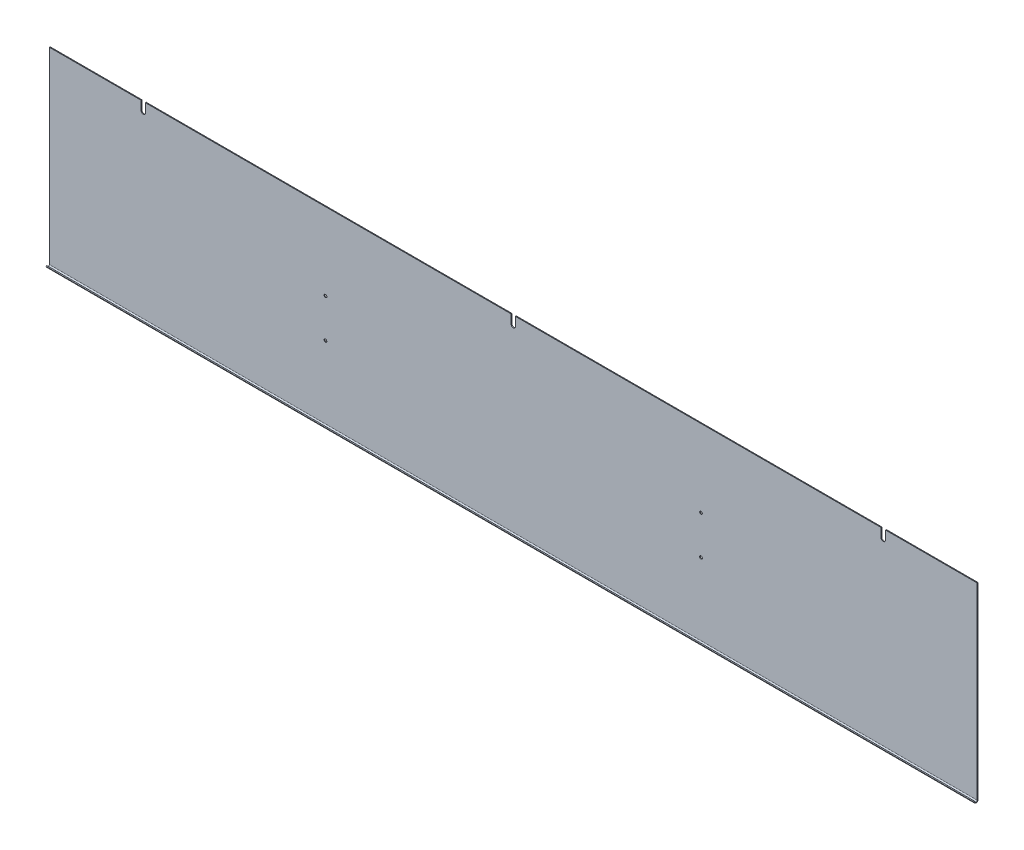
ISO-10303-21;
HEADER;
FILE_DESCRIPTION(('STEP AP214'),'2;1');
FILE_NAME('part.step','',(''),(''),'','','');
FILE_SCHEMA(('AUTOMOTIVE_DESIGN { 1 0 10303 214 1 1 1 1 }'));
ENDSEC;
DATA;
#1=APPLICATION_CONTEXT('core data for automotive mechanical design processes');
#2=APPLICATION_PROTOCOL_DEFINITION('international standard','automotive_design',2000,#1);
#3=PRODUCT_CONTEXT('',#1,'mechanical');
#4=PRODUCT('Part','Part','',(#3));
#5=PRODUCT_RELATED_PRODUCT_CATEGORY('part','',(#4));
#6=PRODUCT_DEFINITION_FORMATION('','',#4);
#7=PRODUCT_DEFINITION_CONTEXT('part definition',#1,'design');
#8=PRODUCT_DEFINITION('design','',#6,#7);
#9=PRODUCT_DEFINITION_SHAPE('','',#8);
#10=(LENGTH_UNIT() NAMED_UNIT(*) SI_UNIT(.MILLI.,.METRE.));
#11=(NAMED_UNIT(*) PLANE_ANGLE_UNIT() SI_UNIT($,.RADIAN.));
#12=(NAMED_UNIT(*) SI_UNIT($,.STERADIAN.) SOLID_ANGLE_UNIT());
#13=UNCERTAINTY_MEASURE_WITH_UNIT(LENGTH_MEASURE(1.E-05),#10,'distance_accuracy_value','');
#14=(GEOMETRIC_REPRESENTATION_CONTEXT(3) GLOBAL_UNCERTAINTY_ASSIGNED_CONTEXT((#13)) GLOBAL_UNIT_ASSIGNED_CONTEXT((#10,
#11,#12)) REPRESENTATION_CONTEXT('',''));
#15=CARTESIAN_POINT('',(0.,0.,0.));
#16=DIRECTION('',(0.,0.,1.));
#17=DIRECTION('',(1.,0.,0.));
#18=AXIS2_PLACEMENT_3D('',#15,#16,#17);
#19=CARTESIAN_POINT('',(1035.52884615385,125.360576923077,-1.5));
#20=DIRECTION('',(0.,1.,0.));
#21=DIRECTION('',(-1.,0.,0.));
#22=AXIS2_PLACEMENT_3D('',#19,#20,#21);
#23=PLANE('',#22);
#24=DIRECTION('',(0.,0.,-1.));
#25=VECTOR('',#24,1.);
#26=CARTESIAN_POINT('',(869.528846153846,125.360576923077,-1.5));
#27=LINE('',#26,#25);
#28=CARTESIAN_POINT('',(869.528846153846,125.360576923077,0.));
#29=VERTEX_POINT('',#28);
#30=CARTESIAN_POINT('',(869.528846153846,125.360576923077,-1.5));
#31=VERTEX_POINT('',#30);
#32=EDGE_CURVE('E13',#29,#31,#27,.T.);
#33=ORIENTED_EDGE('',*,*,#32,.F.);
#34=DIRECTION('',(-1.,0.,0.));
#35=VECTOR('',#34,1.);
#36=CARTESIAN_POINT('',(1035.52884615385,125.360576923077,0.));
#37=LINE('',#36,#35);
#38=CARTESIAN_POINT('',(1035.52884615385,125.360576923077,0.));
#39=VERTEX_POINT('',#38);
#40=EDGE_CURVE('E221',#39,#29,#37,.T.);
#41=ORIENTED_EDGE('',*,*,#40,.F.);
#42=DIRECTION('',(0.,0.,1.));
#43=VECTOR('',#42,1.);
#44=CARTESIAN_POINT('',(1035.52884615385,125.360576923077,-1.5));
#45=LINE('',#44,#43);
#46=CARTESIAN_POINT('',(1035.52884615385,125.360576923077,-1.5));
#47=VERTEX_POINT('',#46);
#48=EDGE_CURVE('E238',#47,#39,#45,.T.);
#49=ORIENTED_EDGE('',*,*,#48,.F.);
#50=DIRECTION('',(-1.,0.,0.));
#51=VECTOR('',#50,1.);
#52=CARTESIAN_POINT('',(1035.52884615385,125.360576923077,-1.5));
#53=LINE('',#52,#51);
#54=EDGE_CURVE('E261',#47,#31,#53,.T.);
#55=ORIENTED_EDGE('',*,*,#54,.T.);
#56=EDGE_LOOP('',(#33,#41,#49,#55));
#57=FACE_BOUND('',#56,.T.);
#58=ADVANCED_FACE('F58',(#57),#23,.T.);
#59=DIRECTION('',(0.,0.,1.));
#60=VECTOR('',#59,1.);
#61=CARTESIAN_POINT('',(861.528846153846,125.360576923077,-1.5));
#62=LINE('',#61,#60);
#63=CARTESIAN_POINT('',(861.528846153846,125.360576923077,-1.5));
#64=VERTEX_POINT('',#63);
#65=CARTESIAN_POINT('',(861.528846153846,125.360576923077,0.));
#66=VERTEX_POINT('',#65);
#67=EDGE_CURVE('E66',#64,#66,#62,.T.);
#68=ORIENTED_EDGE('',*,*,#67,.F.);
#69=CARTESIAN_POINT('',(199.528846153846,125.360576923077,-1.5));
#70=VERTEX_POINT('',#69);
#71=EDGE_CURVE('E258',#64,#70,#53,.T.);
#72=ORIENTED_EDGE('',*,*,#71,.T.);
#73=DIRECTION('',(0.,0.,-1.));
#74=VECTOR('',#73,1.);
#75=CARTESIAN_POINT('',(199.528846153846,125.360576923077,-1.5));
#76=LINE('',#75,#74);
#77=CARTESIAN_POINT('',(199.528846153846,125.360576923077,0.));
#78=VERTEX_POINT('',#77);
#79=EDGE_CURVE('E207',#78,#70,#76,.T.);
#80=ORIENTED_EDGE('',*,*,#79,.F.);
#81=EDGE_CURVE('E213',#66,#78,#37,.T.);
#82=ORIENTED_EDGE('',*,*,#81,.F.);
#83=EDGE_LOOP('',(#68,#72,#80,#82));
#84=FACE_BOUND('',#83,.T.);
#85=ADVANCED_FACE('F220',(#84),#23,.T.);
#86=DIRECTION('',(0.,0.,1.));
#87=VECTOR('',#86,1.);
#88=CARTESIAN_POINT('',(191.528846153846,125.360576923077,-1.5));
#89=LINE('',#88,#87);
#90=CARTESIAN_POINT('',(191.528846153846,125.360576923077,-1.5));
#91=VERTEX_POINT('',#90);
#92=CARTESIAN_POINT('',(191.528846153846,125.360576923077,0.));
#93=VERTEX_POINT('',#92);
#94=EDGE_CURVE('E245',#91,#93,#89,.T.);
#95=ORIENTED_EDGE('',*,*,#94,.F.);
#96=CARTESIAN_POINT('',(-470.471153846154,125.360576923077,-1.5));
#97=VERTEX_POINT('',#96);
#98=EDGE_CURVE('E262',#91,#97,#53,.T.);
#99=ORIENTED_EDGE('',*,*,#98,.T.);
#100=DIRECTION('',(0.,0.,-1.));
#101=VECTOR('',#100,1.);
#102=CARTESIAN_POINT('',(-470.471153846154,125.360576923077,-1.5));
#103=LINE('',#102,#101);
#104=CARTESIAN_POINT('',(-470.471153846154,125.360576923077,0.));
#105=VERTEX_POINT('',#104);
#106=EDGE_CURVE('E243',#105,#97,#103,.T.);
#107=ORIENTED_EDGE('',*,*,#106,.F.);
#108=EDGE_CURVE('E222',#93,#105,#37,.T.);
#109=ORIENTED_EDGE('',*,*,#108,.F.);
#110=EDGE_LOOP('',(#95,#99,#107,#109));
#111=FACE_BOUND('',#110,.T.);
#112=ADVANCED_FACE('F431',(#111),#23,.T.);
#113=CARTESIAN_POINT('',(1035.52884615385,125.360576923077,-1.5));
#114=DIRECTION('',(1.,0.,0.));
#115=DIRECTION('',(0.,0.,-1.));
#116=AXIS2_PLACEMENT_3D('',#113,#114,#115);
#117=PLANE('',#116);
#118=DIRECTION('',(0.,1.,0.));
#119=VECTOR('',#118,1.);
#120=CARTESIAN_POINT('',(1035.52884615385,125.360576923077,0.));
#121=LINE('',#120,#119);
#122=CARTESIAN_POINT('',(1035.52884615385,-215.175321461785,0.));
#123=VERTEX_POINT('',#122);
#124=EDGE_CURVE('E229',#123,#39,#121,.T.);
#125=ORIENTED_EDGE('',*,*,#124,.F.);
#126=DIRECTION('',(0.,0.,-1.));
#127=VECTOR('',#126,1.);
#128=CARTESIAN_POINT('',(1035.52884615385,-215.175321461785,0.));
#129=LINE('',#128,#127);
#130=CARTESIAN_POINT('',(1035.52884615385,-215.175321461785,-1.49999999999992));
#131=VERTEX_POINT('',#130);
#132=EDGE_CURVE('E289',#123,#131,#129,.T.);
#133=ORIENTED_EDGE('',*,*,#132,.T.);
#134=DIRECTION('',(0.,1.,0.));
#135=VECTOR('',#134,1.);
#136=CARTESIAN_POINT('',(1035.52884615385,125.360576923077,-1.5));
#137=LINE('',#136,#135);
#138=EDGE_CURVE('E233',#131,#47,#137,.T.);
#139=ORIENTED_EDGE('',*,*,#138,.T.);
#140=ORIENTED_EDGE('',*,*,#48,.T.);
#141=EDGE_LOOP('',(#125,#133,#139,#140));
#142=FACE_BOUND('',#141,.T.);
#143=ADVANCED_FACE('F60',(#142),#117,.T.);
#144=CARTESIAN_POINT('',(0.,0.,-1.5));
#145=DIRECTION('',(0.,0.,-1.));
#146=DIRECTION('',(-1.,0.,0.));
#147=AXIS2_PLACEMENT_3D('',#144,#145,#146);
#148=PLANE('',#147);
#149=CARTESIAN_POINT('',(-144.471153846154,-84.6394230769227,-1.5));
#150=DIRECTION('',(0.,0.,-1.));
#151=DIRECTION('',(-1.,0.,0.));
#152=AXIS2_PLACEMENT_3D('',#149,#150,#151);
#153=CIRCLE('',#152,2.50000000000002);
#154=CARTESIAN_POINT('',(-146.971153846154,-84.6394230769227,-1.5));
#155=VERTEX_POINT('',#154);
#156=EDGE_CURVE('E363',#155,#155,#153,.T.);
#157=ORIENTED_EDGE('',*,*,#156,.F.);
#158=EDGE_LOOP('',(#157));
#159=FACE_BOUND('',#158,.T.);
#160=CARTESIAN_POINT('',(535.528846153846,-84.639423076923,-1.5));
#161=DIRECTION('',(0.,0.,-1.));
#162=DIRECTION('',(-1.,0.,0.));
#163=AXIS2_PLACEMENT_3D('',#160,#161,#162);
#164=CIRCLE('',#163,2.50000000000003);
#165=CARTESIAN_POINT('',(533.028846153846,-84.639423076923,-1.5));
#166=VERTEX_POINT('',#165);
#167=EDGE_CURVE('E360',#166,#166,#164,.T.);
#168=ORIENTED_EDGE('',*,*,#167,.F.);
#169=EDGE_LOOP('',(#168));
#170=FACE_BOUND('',#169,.T.);
#171=CARTESIAN_POINT('',(535.528846153846,-14.639423076923,-1.5));
#172=DIRECTION('',(0.,0.,-1.));
#173=DIRECTION('',(-1.,0.,0.));
#174=AXIS2_PLACEMENT_3D('',#171,#172,#173);
#175=CIRCLE('',#174,2.50000000000003);
#176=CARTESIAN_POINT('',(533.028846153846,-14.639423076923,-1.5));
#177=VERTEX_POINT('',#176);
#178=EDGE_CURVE('E357',#177,#177,#175,.T.);
#179=ORIENTED_EDGE('',*,*,#178,.F.);
#180=EDGE_LOOP('',(#179));
#181=FACE_BOUND('',#180,.T.);
#182=DIRECTION('',(0.,-1.,0.));
#183=VECTOR('',#182,1.);
#184=CARTESIAN_POINT('',(869.528846153846,0.,-1.5));
#185=LINE('',#184,#183);
#186=CARTESIAN_POINT('',(869.528846153846,109.360576923077,-1.5));
#187=VERTEX_POINT('',#186);
#188=EDGE_CURVE('E350',#31,#187,#185,.T.);
#189=ORIENTED_EDGE('',*,*,#188,.F.);
#190=ORIENTED_EDGE('',*,*,#54,.F.);
#191=ORIENTED_EDGE('',*,*,#138,.F.);
#192=DIRECTION('',(1.,0.,0.));
#193=VECTOR('',#192,1.);
#194=CARTESIAN_POINT('',(1035.52884615385,-215.175321461785,-1.49999999999992));
#195=LINE('',#194,#193);
#196=CARTESIAN_POINT('',(-644.471153846154,-215.175321461785,-1.5));
#197=VERTEX_POINT('',#196);
#198=EDGE_CURVE('E281',#131,#197,#195,.F.);
#199=ORIENTED_EDGE('',*,*,#198,.T.);
#200=DIRECTION('',(0.,-1.,0.));
#201=VECTOR('',#200,1.);
#202=CARTESIAN_POINT('',(-644.471153846154,125.360576923077,-1.5));
#203=LINE('',#202,#201);
#204=CARTESIAN_POINT('',(-644.471153846154,125.360576923077,-1.5));
#205=VERTEX_POINT('',#204);
#206=EDGE_CURVE('E241',#205,#197,#203,.T.);
#207=ORIENTED_EDGE('',*,*,#206,.F.);
#208=CARTESIAN_POINT('',(-478.471153846154,125.360576923077,-1.5));
#209=VERTEX_POINT('',#208);
#210=EDGE_CURVE('E265',#209,#205,#53,.T.);
#211=ORIENTED_EDGE('',*,*,#210,.F.);
#212=DIRECTION('',(0.,1.,0.));
#213=VECTOR('',#212,1.);
#214=CARTESIAN_POINT('',(-478.471153846154,0.,-1.5));
#215=LINE('',#214,#213);
#216=CARTESIAN_POINT('',(-478.471153846154,109.360576923077,-1.5));
#217=VERTEX_POINT('',#216);
#218=EDGE_CURVE('E73',#217,#209,#215,.T.);
#219=ORIENTED_EDGE('',*,*,#218,.F.);
#220=CARTESIAN_POINT('',(-474.471153846154,109.360576923077,-1.5));
#221=DIRECTION('',(0.,0.,-1.));
#222=DIRECTION('',(-1.,0.,0.));
#223=AXIS2_PLACEMENT_3D('',#220,#221,#222);
#224=CIRCLE('',#223,4.);
#225=CARTESIAN_POINT('',(-470.471153846154,109.360576923077,-1.5));
#226=VERTEX_POINT('',#225);
#227=EDGE_CURVE('E352',#226,#217,#224,.T.);
#228=ORIENTED_EDGE('',*,*,#227,.F.);
#229=DIRECTION('',(0.,-1.,0.));
#230=VECTOR('',#229,1.);
#231=CARTESIAN_POINT('',(-470.471153846154,0.,-1.5));
#232=LINE('',#231,#230);
#233=EDGE_CURVE('E345',#97,#226,#232,.T.);
#234=ORIENTED_EDGE('',*,*,#233,.F.);
#235=ORIENTED_EDGE('',*,*,#98,.F.);
#236=DIRECTION('',(0.,1.,0.));
#237=VECTOR('',#236,1.);
#238=CARTESIAN_POINT('',(191.528846153846,0.,-1.5));
#239=LINE('',#238,#237);
#240=CARTESIAN_POINT('',(191.528846153846,109.360576923077,-1.5));
#241=VERTEX_POINT('',#240);
#242=EDGE_CURVE('E81',#241,#91,#239,.T.);
#243=ORIENTED_EDGE('',*,*,#242,.F.);
#244=CARTESIAN_POINT('',(195.528846153846,109.360576923077,-1.5));
#245=DIRECTION('',(0.,0.,-1.));
#246=DIRECTION('',(-1.,0.,0.));
#247=AXIS2_PLACEMENT_3D('',#244,#245,#246);
#248=CIRCLE('',#247,4.);
#249=CARTESIAN_POINT('',(199.528846153846,109.360576923077,-1.5));
#250=VERTEX_POINT('',#249);
#251=EDGE_CURVE('E259',#250,#241,#248,.T.);
#252=ORIENTED_EDGE('',*,*,#251,.F.);
#253=DIRECTION('',(0.,-1.,0.));
#254=VECTOR('',#253,1.);
#255=CARTESIAN_POINT('',(199.528846153846,0.,-1.5));
#256=LINE('',#255,#254);
#257=EDGE_CURVE('E250',#70,#250,#256,.T.);
#258=ORIENTED_EDGE('',*,*,#257,.F.);
#259=ORIENTED_EDGE('',*,*,#71,.F.);
#260=DIRECTION('',(0.,1.,0.));
#261=VECTOR('',#260,1.);
#262=CARTESIAN_POINT('',(861.528846153846,0.,-1.5));
#263=LINE('',#262,#261);
#264=CARTESIAN_POINT('',(861.528846153846,109.360576923077,-1.5));
#265=VERTEX_POINT('',#264);
#266=EDGE_CURVE('E202',#265,#64,#263,.T.);
#267=ORIENTED_EDGE('',*,*,#266,.F.);
#268=CARTESIAN_POINT('',(865.528846153846,109.360576923077,-1.5));
#269=DIRECTION('',(0.,0.,-1.));
#270=DIRECTION('',(-1.,0.,0.));
#271=AXIS2_PLACEMENT_3D('',#268,#269,#270);
#272=CIRCLE('',#271,4.);
#273=EDGE_CURVE('E355',#187,#265,#272,.T.);
#274=ORIENTED_EDGE('',*,*,#273,.F.);
#275=EDGE_LOOP('',(#189,#190,#191,#199,#207,#211,#219,#228,#234,#235,#243,#252,#258,#259,#267,#274));
#276=FACE_BOUND('',#275,.T.);
#277=CARTESIAN_POINT('',(-144.471153846154,-14.6394230769227,-1.5));
#278=DIRECTION('',(0.,0.,-1.));
#279=DIRECTION('',(-1.,0.,0.));
#280=AXIS2_PLACEMENT_3D('',#277,#278,#279);
#281=CIRCLE('',#280,2.50000000000002);
#282=CARTESIAN_POINT('',(-146.971153846154,-14.6394230769227,-1.5));
#283=VERTEX_POINT('',#282);
#284=EDGE_CURVE('E369',#283,#283,#281,.T.);
#285=ORIENTED_EDGE('',*,*,#284,.F.);
#286=EDGE_LOOP('',(#285));
#287=FACE_BOUND('',#286,.T.);
#288=ADVANCED_FACE('F256',(#159,#170,#181,#276,#287),#148,.T.);
#289=CARTESIAN_POINT('',(0.,0.,0.));
#290=DIRECTION('',(0.,0.,-1.));
#291=DIRECTION('',(-1.,0.,0.));
#292=AXIS2_PLACEMENT_3D('',#289,#290,#291);
#293=PLANE('',#292);
#294=CARTESIAN_POINT('',(-144.471153846154,-84.6394230769227,0.));
#295=DIRECTION('',(0.,0.,1.));
#296=DIRECTION('',(1.,0.,0.));
#297=AXIS2_PLACEMENT_3D('',#294,#295,#296);
#298=CIRCLE('',#297,2.50000000000002);
#299=CARTESIAN_POINT('',(-141.971153846154,-84.6394230769227,0.));
#300=VERTEX_POINT('',#299);
#301=EDGE_CURVE('E346',#300,#300,#298,.T.);
#302=ORIENTED_EDGE('',*,*,#301,.F.);
#303=EDGE_LOOP('',(#302));
#304=FACE_BOUND('',#303,.T.);
#305=CARTESIAN_POINT('',(535.528846153846,-84.639423076923,0.));
#306=DIRECTION('',(0.,0.,1.));
#307=DIRECTION('',(1.,0.,0.));
#308=AXIS2_PLACEMENT_3D('',#305,#306,#307);
#309=CIRCLE('',#308,2.50000000000003);
#310=CARTESIAN_POINT('',(538.028846153846,-84.639423076923,0.));
#311=VERTEX_POINT('',#310);
#312=EDGE_CURVE('E495',#311,#311,#309,.T.);
#313=ORIENTED_EDGE('',*,*,#312,.F.);
#314=EDGE_LOOP('',(#313));
#315=FACE_BOUND('',#314,.T.);
#316=CARTESIAN_POINT('',(535.528846153846,-14.639423076923,0.));
#317=DIRECTION('',(0.,0.,1.));
#318=DIRECTION('',(1.,0.,0.));
#319=AXIS2_PLACEMENT_3D('',#316,#317,#318);
#320=CIRCLE('',#319,2.50000000000003);
#321=CARTESIAN_POINT('',(538.028846153846,-14.639423076923,0.));
#322=VERTEX_POINT('',#321);
#323=EDGE_CURVE('E499',#322,#322,#320,.T.);
#324=ORIENTED_EDGE('',*,*,#323,.F.);
#325=EDGE_LOOP('',(#324));
#326=FACE_BOUND('',#325,.T.);
#327=CARTESIAN_POINT('',(-144.471153846154,-14.6394230769227,0.));
#328=DIRECTION('',(0.,0.,1.));
#329=DIRECTION('',(1.,0.,0.));
#330=AXIS2_PLACEMENT_3D('',#327,#328,#329);
#331=CIRCLE('',#330,2.50000000000002);
#332=CARTESIAN_POINT('',(-141.971153846154,-14.6394230769227,0.));
#333=VERTEX_POINT('',#332);
#334=EDGE_CURVE('E366',#333,#333,#331,.T.);
#335=ORIENTED_EDGE('',*,*,#334,.F.);
#336=EDGE_LOOP('',(#335));
#337=FACE_BOUND('',#336,.T.);
#338=ORIENTED_EDGE('',*,*,#40,.T.);
#339=DIRECTION('',(0.,1.,0.));
#340=VECTOR('',#339,1.);
#341=CARTESIAN_POINT('',(869.528846153846,125.360576923077,0.));
#342=LINE('',#341,#340);
#343=CARTESIAN_POINT('',(869.528846153846,109.360576923077,0.));
#344=VERTEX_POINT('',#343);
#345=EDGE_CURVE('E511',#344,#29,#342,.T.);
#346=ORIENTED_EDGE('',*,*,#345,.F.);
#347=CARTESIAN_POINT('',(865.528846153846,109.360576923077,0.));
#348=DIRECTION('',(0.,0.,1.));
#349=DIRECTION('',(1.,0.,0.));
#350=AXIS2_PLACEMENT_3D('',#347,#348,#349);
#351=CIRCLE('',#350,4.);
#352=CARTESIAN_POINT('',(861.528846153846,109.360576923077,0.));
#353=VERTEX_POINT('',#352);
#354=EDGE_CURVE('E216',#353,#344,#351,.T.);
#355=ORIENTED_EDGE('',*,*,#354,.F.);
#356=DIRECTION('',(0.,-1.,0.));
#357=VECTOR('',#356,1.);
#358=CARTESIAN_POINT('',(861.528846153846,125.360576923077,0.));
#359=LINE('',#358,#357);
#360=EDGE_CURVE('E199',#66,#353,#359,.T.);
#361=ORIENTED_EDGE('',*,*,#360,.F.);
#362=ORIENTED_EDGE('',*,*,#81,.T.);
#363=DIRECTION('',(0.,1.,0.));
#364=VECTOR('',#363,1.);
#365=CARTESIAN_POINT('',(199.528846153846,125.360576923077,0.));
#366=LINE('',#365,#364);
#367=CARTESIAN_POINT('',(199.528846153846,109.360576923077,0.));
#368=VERTEX_POINT('',#367);
#369=EDGE_CURVE('E252',#368,#78,#366,.T.);
#370=ORIENTED_EDGE('',*,*,#369,.F.);
#371=CARTESIAN_POINT('',(195.528846153846,109.360576923077,0.));
#372=DIRECTION('',(0.,0.,1.));
#373=DIRECTION('',(1.,0.,0.));
#374=AXIS2_PLACEMENT_3D('',#371,#372,#373);
#375=CIRCLE('',#374,4.);
#376=CARTESIAN_POINT('',(191.528846153846,109.360576923077,0.));
#377=VERTEX_POINT('',#376);
#378=EDGE_CURVE('E515',#377,#368,#375,.T.);
#379=ORIENTED_EDGE('',*,*,#378,.F.);
#380=DIRECTION('',(0.,-1.,0.));
#381=VECTOR('',#380,1.);
#382=CARTESIAN_POINT('',(191.528846153846,125.360576923077,0.));
#383=LINE('',#382,#381);
#384=EDGE_CURVE('E342',#93,#377,#383,.T.);
#385=ORIENTED_EDGE('',*,*,#384,.F.);
#386=ORIENTED_EDGE('',*,*,#108,.T.);
#387=DIRECTION('',(0.,1.,0.));
#388=VECTOR('',#387,1.);
#389=CARTESIAN_POINT('',(-470.471153846154,125.360576923077,0.));
#390=LINE('',#389,#388);
#391=CARTESIAN_POINT('',(-470.471153846154,109.360576923077,0.));
#392=VERTEX_POINT('',#391);
#393=EDGE_CURVE('E333',#392,#105,#390,.T.);
#394=ORIENTED_EDGE('',*,*,#393,.F.);
#395=CARTESIAN_POINT('',(-474.471153846154,109.360576923077,0.));
#396=DIRECTION('',(0.,0.,1.));
#397=DIRECTION('',(1.,0.,0.));
#398=AXIS2_PLACEMENT_3D('',#395,#396,#397);
#399=CIRCLE('',#398,4.);
#400=CARTESIAN_POINT('',(-478.471153846154,109.360576923077,0.));
#401=VERTEX_POINT('',#400);
#402=EDGE_CURVE('E329',#401,#392,#399,.T.);
#403=ORIENTED_EDGE('',*,*,#402,.F.);
#404=DIRECTION('',(0.,-1.,0.));
#405=VECTOR('',#404,1.);
#406=CARTESIAN_POINT('',(-478.471153846154,125.360576923077,0.));
#407=LINE('',#406,#405);
#408=CARTESIAN_POINT('',(-478.471153846154,125.360576923077,0.));
#409=VERTEX_POINT('',#408);
#410=EDGE_CURVE('E324',#409,#401,#407,.T.);
#411=ORIENTED_EDGE('',*,*,#410,.F.);
#412=CARTESIAN_POINT('',(-644.471153846154,125.360576923077,0.));
#413=VERTEX_POINT('',#412);
#414=EDGE_CURVE('E225',#409,#413,#37,.T.);
#415=ORIENTED_EDGE('',*,*,#414,.T.);
#416=DIRECTION('',(0.,-1.,0.));
#417=VECTOR('',#416,1.);
#418=CARTESIAN_POINT('',(-644.471153846154,125.360576923077,0.));
#419=LINE('',#418,#417);
#420=CARTESIAN_POINT('',(-644.471153846154,-215.175321461785,0.));
#421=VERTEX_POINT('',#420);
#422=EDGE_CURVE('E224',#413,#421,#419,.T.);
#423=ORIENTED_EDGE('',*,*,#422,.T.);
#424=DIRECTION('',(1.,0.,0.));
#425=VECTOR('',#424,1.);
#426=CARTESIAN_POINT('',(1035.52884615385,-215.175321461785,0.));
#427=LINE('',#426,#425);
#428=EDGE_CURVE('E299',#123,#421,#427,.F.);
#429=ORIENTED_EDGE('',*,*,#428,.F.);
#430=ORIENTED_EDGE('',*,*,#124,.T.);
#431=EDGE_LOOP('',(#338,#346,#355,#361,#362,#370,#379,#385,#386,#394,#403,#411,#415,#423,#429,#430));
#432=FACE_BOUND('',#431,.T.);
#433=ADVANCED_FACE('F211',(#304,#315,#326,#337,#432),#293,.F.);
#434=CARTESIAN_POINT('',(-644.471153846154,125.360576923077,-1.5));
#435=DIRECTION('',(-1.,0.,0.));
#436=DIRECTION('',(0.,0.,1.));
#437=AXIS2_PLACEMENT_3D('',#434,#435,#436);
#438=PLANE('',#437);
#439=DIRECTION('',(0.,0.,-1.));
#440=VECTOR('',#439,1.);
#441=CARTESIAN_POINT('',(-644.471153846154,-215.175321461785,0.));
#442=LINE('',#441,#440);
#443=EDGE_CURVE('E277',#421,#197,#442,.T.);
#444=ORIENTED_EDGE('',*,*,#443,.F.);
#445=ORIENTED_EDGE('',*,*,#422,.F.);
#446=DIRECTION('',(0.,0.,1.));
#447=VECTOR('',#446,1.);
#448=CARTESIAN_POINT('',(-644.471153846154,125.360576923077,-1.5));
#449=LINE('',#448,#447);
#450=EDGE_CURVE('E234',#205,#413,#449,.T.);
#451=ORIENTED_EDGE('',*,*,#450,.F.);
#452=ORIENTED_EDGE('',*,*,#206,.T.);
#453=EDGE_LOOP('',(#444,#445,#451,#452));
#454=FACE_BOUND('',#453,.T.);
#455=ADVANCED_FACE('F274',(#454),#438,.T.);
#456=DIRECTION('',(0.,0.,1.));
#457=VECTOR('',#456,1.);
#458=CARTESIAN_POINT('',(-478.471153846154,125.360576923077,-1.5));
#459=LINE('',#458,#457);
#460=EDGE_CURVE('E237',#209,#409,#459,.T.);
#461=ORIENTED_EDGE('',*,*,#460,.F.);
#462=ORIENTED_EDGE('',*,*,#210,.T.);
#463=ORIENTED_EDGE('',*,*,#450,.T.);
#464=ORIENTED_EDGE('',*,*,#414,.F.);
#465=EDGE_LOOP('',(#461,#462,#463,#464));
#466=FACE_BOUND('',#465,.T.);
#467=ADVANCED_FACE('F326',(#466),#23,.T.);
#468=CARTESIAN_POINT('',(-644.471153846154,-215.175321461785,2.00000000000009));
#469=DIRECTION('',(-1.,0.,0.));
#470=DIRECTION('',(0.,0.,1.));
#471=AXIS2_PLACEMENT_3D('',#468,#469,#470);
#472=PLANE('',#471);
#473=DIRECTION('',(0.,-0.500000000000002,0.866025403784438));
#474=VECTOR('',#473,1.);
#475=CARTESIAN_POINT('',(-644.471153846154,-216.925321461785,5.03108891324554));
#476=LINE('',#475,#474);
#477=CARTESIAN_POINT('',(-644.471153846154,-216.175321461785,3.73205080756897));
#478=VERTEX_POINT('',#477);
#479=CARTESIAN_POINT('',(-644.471153846154,-216.925321461785,5.03108891324563));
#480=VERTEX_POINT('',#479);
#481=EDGE_CURVE('E294',#478,#480,#476,.T.);
#482=ORIENTED_EDGE('',*,*,#481,.F.);
#483=CARTESIAN_POINT('',(-644.471153846154,-215.175321461785,2.00000000000009));
#484=DIRECTION('',(1.,0.,0.));
#485=DIRECTION('',(0.,0.,-1.));
#486=AXIS2_PLACEMENT_3D('',#483,#484,#485);
#487=CIRCLE('',#486,2.);
#488=EDGE_CURVE('E291',#421,#478,#487,.F.);
#489=ORIENTED_EDGE('',*,*,#488,.F.);
#490=ORIENTED_EDGE('',*,*,#443,.T.);
#491=CARTESIAN_POINT('',(-644.471153846154,-215.175321461785,2.00000000000009));
#492=DIRECTION('',(1.,0.,0.));
#493=DIRECTION('',(0.,0.,-1.));
#494=AXIS2_PLACEMENT_3D('',#491,#492,#493);
#495=CIRCLE('',#494,3.5);
#496=EDGE_CURVE('E285',#197,#480,#495,.F.);
#497=ORIENTED_EDGE('',*,*,#496,.T.);
#498=EDGE_LOOP('',(#482,#489,#490,#497));
#499=FACE_BOUND('',#498,.T.);
#500=ADVANCED_FACE('F435',(#499),#472,.T.);
#501=CARTESIAN_POINT('',(1035.52884615385,-215.175321461785,2.00000000000009));
#502=DIRECTION('',(-1.,0.,0.));
#503=DIRECTION('',(0.,0.,1.));
#504=AXIS2_PLACEMENT_3D('',#501,#502,#503);
#505=PLANE('',#504);
#506=CARTESIAN_POINT('',(1035.52884615385,-215.175321461785,2.00000000000009));
#507=DIRECTION('',(1.,0.,0.));
#508=DIRECTION('',(0.,0.,-1.));
#509=AXIS2_PLACEMENT_3D('',#506,#507,#508);
#510=CIRCLE('',#509,2.);
#511=CARTESIAN_POINT('',(1035.52884615385,-216.175321461785,3.73205080756897));
#512=VERTEX_POINT('',#511);
#513=EDGE_CURVE('E301',#512,#123,#510,.T.);
#514=ORIENTED_EDGE('',*,*,#513,.F.);
#515=DIRECTION('',(0.,-0.500000000000002,0.866025403784438));
#516=VECTOR('',#515,1.);
#517=CARTESIAN_POINT('',(1035.52884615385,-216.175321461785,3.7320508075689));
#518=LINE('',#517,#516);
#519=CARTESIAN_POINT('',(1035.52884615385,-216.925321461785,5.0310889132456));
#520=VERTEX_POINT('',#519);
#521=EDGE_CURVE('E394',#512,#520,#518,.T.);
#522=ORIENTED_EDGE('',*,*,#521,.T.);
#523=CARTESIAN_POINT('',(1035.52884615385,-215.175321461785,2.00000000000009));
#524=DIRECTION('',(1.,0.,0.));
#525=DIRECTION('',(0.,0.,-1.));
#526=AXIS2_PLACEMENT_3D('',#523,#524,#525);
#527=CIRCLE('',#526,3.5);
#528=EDGE_CURVE('E286',#520,#131,#527,.T.);
#529=ORIENTED_EDGE('',*,*,#528,.T.);
#530=ORIENTED_EDGE('',*,*,#132,.F.);
#531=EDGE_LOOP('',(#514,#522,#529,#530));
#532=FACE_BOUND('',#531,.T.);
#533=ADVANCED_FACE('F311',(#532),#505,.F.);
#534=CARTESIAN_POINT('',(1035.52884615385,-215.175321461785,2.00000000000009));
#535=DIRECTION('',(1.,0.,0.));
#536=DIRECTION('',(0.,-0.500000000000002,0.866025403784438));
#537=AXIS2_PLACEMENT_3D('',#534,#535,#536);
#538=CYLINDRICAL_SURFACE('',#537,3.5);
#539=ORIENTED_EDGE('',*,*,#198,.F.);
#540=ORIENTED_EDGE('',*,*,#528,.F.);
#541=DIRECTION('',(1.,0.,0.));
#542=VECTOR('',#541,1.);
#543=CARTESIAN_POINT('',(0.,-216.925321461785,5.03108891324557));
#544=LINE('',#543,#542);
#545=EDGE_CURVE('E391',#480,#520,#544,.T.);
#546=ORIENTED_EDGE('',*,*,#545,.F.);
#547=ORIENTED_EDGE('',*,*,#496,.F.);
#548=EDGE_LOOP('',(#539,#540,#546,#547));
#549=FACE_BOUND('',#548,.T.);
#550=ADVANCED_FACE('F422',(#549),#538,.T.);
#551=CARTESIAN_POINT('',(1035.52884615385,-215.175321461785,2.00000000000009));
#552=DIRECTION('',(1.,0.,0.));
#553=DIRECTION('',(0.,-0.500000000000002,0.866025403784438));
#554=AXIS2_PLACEMENT_3D('',#551,#552,#553);
#555=CYLINDRICAL_SURFACE('',#554,2.);
#556=ORIENTED_EDGE('',*,*,#428,.T.);
#557=ORIENTED_EDGE('',*,*,#488,.T.);
#558=DIRECTION('',(-1.,0.,0.));
#559=VECTOR('',#558,1.);
#560=CARTESIAN_POINT('',(-644.471153846154,-216.175321461785,3.7320508075689));
#561=LINE('',#560,#559);
#562=EDGE_CURVE('E319',#478,#512,#561,.F.);
#563=ORIENTED_EDGE('',*,*,#562,.T.);
#564=ORIENTED_EDGE('',*,*,#513,.T.);
#565=EDGE_LOOP('',(#556,#557,#563,#564));
#566=FACE_BOUND('',#565,.T.);
#567=ADVANCED_FACE('F316',(#566),#555,.F.);
#568=CARTESIAN_POINT('',(1035.52884615385,-223.389423076923,1.29903810567666));
#569=DIRECTION('',(1.,0.,0.));
#570=DIRECTION('',(0.,0.,-1.));
#571=AXIS2_PLACEMENT_3D('',#568,#569,#570);
#572=PLANE('',#571);
#573=DIRECTION('',(0.,-0.866025403784438,-0.500000000000002));
#574=VECTOR('',#573,1.);
#575=CARTESIAN_POINT('',(1035.52884615385,-223.389423076923,1.29903810567669));
#576=LINE('',#575,#574);
#577=CARTESIAN_POINT('',(1035.52884615385,-215.24711823151,6.00000000000004));
#578=VERTEX_POINT('',#577);
#579=EDGE_CURVE('E376',#578,#520,#576,.T.);
#580=ORIENTED_EDGE('',*,*,#579,.T.);
#581=ORIENTED_EDGE('',*,*,#521,.F.);
#582=DIRECTION('',(0.,0.866025403784438,0.500000000000002));
#583=VECTOR('',#582,1.);
#584=CARTESIAN_POINT('',(1035.52884615385,-53.4098557692311,97.7047362399402));
#585=LINE('',#584,#583);
#586=CARTESIAN_POINT('',(1035.52884615385,-214.49711823151,4.70096189432338));
#587=VERTEX_POINT('',#586);
#588=EDGE_CURVE('E384',#587,#512,#585,.F.);
#589=ORIENTED_EDGE('',*,*,#588,.F.);
#590=DIRECTION('',(0.,0.500000000000001,-0.866025403784438));
#591=VECTOR('',#590,1.);
#592=CARTESIAN_POINT('',(1035.52884615385,-215.24711823151,6.00000000000002));
#593=LINE('',#592,#591);
#594=EDGE_CURVE('E304',#578,#587,#593,.T.);
#595=ORIENTED_EDGE('',*,*,#594,.F.);
#596=EDGE_LOOP('',(#580,#581,#589,#595));
#597=FACE_BOUND('',#596,.T.);
#598=ADVANCED_FACE('F414',(#597),#572,.T.);
#599=CARTESIAN_POINT('',(-644.471153846154,-215.24711823151,6.00000000000002));
#600=DIRECTION('',(-1.,0.,0.));
#601=DIRECTION('',(0.,0.,1.));
#602=AXIS2_PLACEMENT_3D('',#599,#600,#601);
#603=PLANE('',#602);
#604=DIRECTION('',(0.,-0.866025403784438,-0.500000000000002));
#605=VECTOR('',#604,1.);
#606=CARTESIAN_POINT('',(-644.471153846154,-53.4098557692311,97.7047362399403));
#607=LINE('',#606,#605);
#608=CARTESIAN_POINT('',(-644.471153846154,-214.49711823151,4.7009618943234));
#609=VERTEX_POINT('',#608);
#610=EDGE_CURVE('E389',#478,#609,#607,.F.);
#611=ORIENTED_EDGE('',*,*,#610,.F.);
#612=ORIENTED_EDGE('',*,*,#481,.T.);
#613=DIRECTION('',(0.,0.866025403784438,0.500000000000002));
#614=VECTOR('',#613,1.);
#615=CARTESIAN_POINT('',(-644.471153846154,-215.24711823151,6.00000000000003));
#616=LINE('',#615,#614);
#617=CARTESIAN_POINT('',(-644.471153846154,-215.24711823151,6.00000000000002));
#618=VERTEX_POINT('',#617);
#619=EDGE_CURVE('E382',#480,#618,#616,.T.);
#620=ORIENTED_EDGE('',*,*,#619,.T.);
#621=DIRECTION('',(0.,0.500000000000001,-0.866025403784438));
#622=VECTOR('',#621,1.);
#623=CARTESIAN_POINT('',(-644.471153846154,-215.24711823151,6.00000000000002));
#624=LINE('',#623,#622);
#625=EDGE_CURVE('E373',#618,#609,#624,.T.);
#626=ORIENTED_EDGE('',*,*,#625,.T.);
#627=EDGE_LOOP('',(#611,#612,#620,#626));
#628=FACE_BOUND('',#627,.T.);
#629=ADVANCED_FACE('F399',(#628),#603,.T.);
#630=CARTESIAN_POINT('',(0.,-54.1598557692311,99.0037743456169));
#631=DIRECTION('',(0.,-0.500000000000002,0.866025403784438));
#632=DIRECTION('',(0.,-0.866025403784438,-0.500000000000002));
#633=AXIS2_PLACEMENT_3D('',#630,#631,#632);
#634=PLANE('',#633);
#635=ORIENTED_EDGE('',*,*,#619,.F.);
#636=ORIENTED_EDGE('',*,*,#545,.T.);
#637=ORIENTED_EDGE('',*,*,#579,.F.);
#638=DIRECTION('',(1.,0.,0.));
#639=VECTOR('',#638,1.);
#640=CARTESIAN_POINT('',(1035.52884615385,-215.24711823151,6.00000000000003));
#641=LINE('',#640,#639);
#642=EDGE_CURVE('E379',#618,#578,#641,.T.);
#643=ORIENTED_EDGE('',*,*,#642,.F.);
#644=EDGE_LOOP('',(#635,#636,#637,#643));
#645=FACE_BOUND('',#644,.T.);
#646=ADVANCED_FACE('F404',(#645),#634,.T.);
#647=CARTESIAN_POINT('',(0.,-53.4098557692311,97.7047362399402));
#648=DIRECTION('',(0.,-0.500000000000002,0.866025403784438));
#649=DIRECTION('',(0.,-0.866025403784438,-0.500000000000002));
#650=AXIS2_PLACEMENT_3D('',#647,#648,#649);
#651=PLANE('',#650);
#652=ORIENTED_EDGE('',*,*,#562,.F.);
#653=ORIENTED_EDGE('',*,*,#610,.T.);
#654=DIRECTION('',(-1.,0.,0.));
#655=VECTOR('',#654,1.);
#656=CARTESIAN_POINT('',(0.,-214.49711823151,4.7009618943234));
#657=LINE('',#656,#655);
#658=EDGE_CURVE('E386',#609,#587,#657,.F.);
#659=ORIENTED_EDGE('',*,*,#658,.T.);
#660=ORIENTED_EDGE('',*,*,#588,.T.);
#661=EDGE_LOOP('',(#652,#653,#659,#660));
#662=FACE_BOUND('',#661,.T.);
#663=ADVANCED_FACE('F411',(#662),#651,.F.);
#664=CARTESIAN_POINT('',(1035.52884615385,-215.24711823151,6.00000000000002));
#665=DIRECTION('',(0.,0.866025403784438,0.500000000000001));
#666=DIRECTION('',(0.,-0.500000000000001,0.866025403784438));
#667=AXIS2_PLACEMENT_3D('',#664,#665,#666);
#668=PLANE('',#667);
#669=ORIENTED_EDGE('',*,*,#658,.F.);
#670=ORIENTED_EDGE('',*,*,#625,.F.);
#671=ORIENTED_EDGE('',*,*,#642,.T.);
#672=ORIENTED_EDGE('',*,*,#594,.T.);
#673=EDGE_LOOP('',(#669,#670,#671,#672));
#674=FACE_BOUND('',#673,.T.);
#675=ADVANCED_FACE('F408',(#674),#668,.T.);
#676=CARTESIAN_POINT('',(-144.471153846154,-14.6394230769227,-10.));
#677=DIRECTION('',(0.,0.,1.));
#678=DIRECTION('',(1.,0.,0.));
#679=AXIS2_PLACEMENT_3D('',#676,#677,#678);
#680=CYLINDRICAL_SURFACE('',#679,2.50000000000002);
#681=ORIENTED_EDGE('',*,*,#284,.T.);
#682=EDGE_LOOP('',(#681));
#683=FACE_BOUND('',#682,.T.);
#684=ORIENTED_EDGE('',*,*,#334,.T.);
#685=EDGE_LOOP('',(#684));
#686=FACE_BOUND('',#685,.T.);
#687=ADVANCED_FACE('F463',(#683,#686),#680,.F.);
#688=CARTESIAN_POINT('',(-470.471153846154,125.360576923077,-10.));
#689=DIRECTION('',(1.,0.,0.));
#690=DIRECTION('',(0.,0.,-1.));
#691=AXIS2_PLACEMENT_3D('',#688,#689,#690);
#692=PLANE('',#691);
#693=ORIENTED_EDGE('',*,*,#233,.T.);
#694=DIRECTION('',(0.,0.,1.));
#695=VECTOR('',#694,1.);
#696=CARTESIAN_POINT('',(-470.471153846154,109.360576923077,-10.));
#697=LINE('',#696,#695);
#698=EDGE_CURVE('E340',#226,#392,#697,.T.);
#699=ORIENTED_EDGE('',*,*,#698,.T.);
#700=ORIENTED_EDGE('',*,*,#393,.T.);
#701=ORIENTED_EDGE('',*,*,#106,.T.);
#702=EDGE_LOOP('',(#693,#699,#700,#701));
#703=FACE_BOUND('',#702,.T.);
#704=ADVANCED_FACE('F454',(#703),#692,.F.);
#705=CARTESIAN_POINT('',(-474.471153846154,109.360576923077,-10.));
#706=DIRECTION('',(0.,0.,1.));
#707=DIRECTION('',(1.,0.,0.));
#708=AXIS2_PLACEMENT_3D('',#705,#706,#707);
#709=CYLINDRICAL_SURFACE('',#708,4.);
#710=ORIENTED_EDGE('',*,*,#227,.T.);
#711=DIRECTION('',(0.,0.,1.));
#712=VECTOR('',#711,1.);
#713=CARTESIAN_POINT('',(-478.471153846154,109.360576923077,-10.));
#714=LINE('',#713,#712);
#715=EDGE_CURVE('E328',#217,#401,#714,.T.);
#716=ORIENTED_EDGE('',*,*,#715,.T.);
#717=ORIENTED_EDGE('',*,*,#402,.T.);
#718=ORIENTED_EDGE('',*,*,#698,.F.);
#719=EDGE_LOOP('',(#710,#716,#717,#718));
#720=FACE_BOUND('',#719,.T.);
#721=ADVANCED_FACE('F455',(#720),#709,.F.);
#722=CARTESIAN_POINT('',(-478.471153846154,125.360576923077,-10.));
#723=DIRECTION('',(-1.,0.,0.));
#724=DIRECTION('',(0.,0.,1.));
#725=AXIS2_PLACEMENT_3D('',#722,#723,#724);
#726=PLANE('',#725);
#727=ORIENTED_EDGE('',*,*,#218,.T.);
#728=ORIENTED_EDGE('',*,*,#460,.T.);
#729=ORIENTED_EDGE('',*,*,#410,.T.);
#730=ORIENTED_EDGE('',*,*,#715,.F.);
#731=EDGE_LOOP('',(#727,#728,#729,#730));
#732=FACE_BOUND('',#731,.T.);
#733=ADVANCED_FACE('F327',(#732),#726,.F.);
#734=CARTESIAN_POINT('',(199.528846153846,125.360576923077,-10.));
#735=DIRECTION('',(1.,0.,0.));
#736=DIRECTION('',(0.,0.,-1.));
#737=AXIS2_PLACEMENT_3D('',#734,#735,#736);
#738=PLANE('',#737);
#739=ORIENTED_EDGE('',*,*,#257,.T.);
#740=DIRECTION('',(0.,0.,1.));
#741=VECTOR('',#740,1.);
#742=CARTESIAN_POINT('',(199.528846153846,109.360576923077,-10.));
#743=LINE('',#742,#741);
#744=EDGE_CURVE('E217',#250,#368,#743,.T.);
#745=ORIENTED_EDGE('',*,*,#744,.T.);
#746=ORIENTED_EDGE('',*,*,#369,.T.);
#747=ORIENTED_EDGE('',*,*,#79,.T.);
#748=EDGE_LOOP('',(#739,#745,#746,#747));
#749=FACE_BOUND('',#748,.T.);
#750=ADVANCED_FACE('F249',(#749),#738,.F.);
#751=CARTESIAN_POINT('',(195.528846153846,109.360576923077,-10.));
#752=DIRECTION('',(0.,0.,1.));
#753=DIRECTION('',(1.,0.,0.));
#754=AXIS2_PLACEMENT_3D('',#751,#752,#753);
#755=CYLINDRICAL_SURFACE('',#754,4.);
#756=ORIENTED_EDGE('',*,*,#251,.T.);
#757=DIRECTION('',(0.,0.,1.));
#758=VECTOR('',#757,1.);
#759=CARTESIAN_POINT('',(191.528846153846,109.360576923077,-10.));
#760=LINE('',#759,#758);
#761=EDGE_CURVE('E519',#241,#377,#760,.T.);
#762=ORIENTED_EDGE('',*,*,#761,.T.);
#763=ORIENTED_EDGE('',*,*,#378,.T.);
#764=ORIENTED_EDGE('',*,*,#744,.F.);
#765=EDGE_LOOP('',(#756,#762,#763,#764));
#766=FACE_BOUND('',#765,.T.);
#767=ADVANCED_FACE('F521',(#766),#755,.F.);
#768=CARTESIAN_POINT('',(191.528846153846,125.360576923077,-10.));
#769=DIRECTION('',(-1.,0.,0.));
#770=DIRECTION('',(0.,0.,1.));
#771=AXIS2_PLACEMENT_3D('',#768,#769,#770);
#772=PLANE('',#771);
#773=ORIENTED_EDGE('',*,*,#242,.T.);
#774=ORIENTED_EDGE('',*,*,#94,.T.);
#775=ORIENTED_EDGE('',*,*,#384,.T.);
#776=ORIENTED_EDGE('',*,*,#761,.F.);
#777=EDGE_LOOP('',(#773,#774,#775,#776));
#778=FACE_BOUND('',#777,.T.);
#779=ADVANCED_FACE('F523',(#778),#772,.F.);
#780=CARTESIAN_POINT('',(869.528846153846,125.360576923077,-10.));
#781=DIRECTION('',(1.,0.,0.));
#782=DIRECTION('',(0.,0.,-1.));
#783=AXIS2_PLACEMENT_3D('',#780,#781,#782);
#784=PLANE('',#783);
#785=ORIENTED_EDGE('',*,*,#188,.T.);
#786=DIRECTION('',(0.,0.,1.));
#787=VECTOR('',#786,1.);
#788=CARTESIAN_POINT('',(869.528846153846,109.360576923077,-10.));
#789=LINE('',#788,#787);
#790=EDGE_CURVE('E503',#187,#344,#789,.T.);
#791=ORIENTED_EDGE('',*,*,#790,.T.);
#792=ORIENTED_EDGE('',*,*,#345,.T.);
#793=ORIENTED_EDGE('',*,*,#32,.T.);
#794=EDGE_LOOP('',(#785,#791,#792,#793));
#795=FACE_BOUND('',#794,.T.);
#796=ADVANCED_FACE('F525',(#795),#784,.F.);
#797=CARTESIAN_POINT('',(865.528846153846,109.360576923077,-10.));
#798=DIRECTION('',(0.,0.,1.));
#799=DIRECTION('',(1.,0.,0.));
#800=AXIS2_PLACEMENT_3D('',#797,#798,#799);
#801=CYLINDRICAL_SURFACE('',#800,4.);
#802=ORIENTED_EDGE('',*,*,#273,.T.);
#803=DIRECTION('',(0.,0.,1.));
#804=VECTOR('',#803,1.);
#805=CARTESIAN_POINT('',(861.528846153846,109.360576923077,-10.));
#806=LINE('',#805,#804);
#807=EDGE_CURVE('E506',#265,#353,#806,.T.);
#808=ORIENTED_EDGE('',*,*,#807,.T.);
#809=ORIENTED_EDGE('',*,*,#354,.T.);
#810=ORIENTED_EDGE('',*,*,#790,.F.);
#811=EDGE_LOOP('',(#802,#808,#809,#810));
#812=FACE_BOUND('',#811,.T.);
#813=ADVANCED_FACE('F530',(#812),#801,.F.);
#814=CARTESIAN_POINT('',(861.528846153846,125.360576923077,-10.));
#815=DIRECTION('',(-1.,0.,0.));
#816=DIRECTION('',(0.,0.,1.));
#817=AXIS2_PLACEMENT_3D('',#814,#815,#816);
#818=PLANE('',#817);
#819=ORIENTED_EDGE('',*,*,#266,.T.);
#820=ORIENTED_EDGE('',*,*,#67,.T.);
#821=ORIENTED_EDGE('',*,*,#360,.T.);
#822=ORIENTED_EDGE('',*,*,#807,.F.);
#823=EDGE_LOOP('',(#819,#820,#821,#822));
#824=FACE_BOUND('',#823,.T.);
#825=ADVANCED_FACE('F197',(#824),#818,.F.);
#826=CARTESIAN_POINT('',(535.528846153846,-14.639423076923,-10.));
#827=DIRECTION('',(0.,0.,1.));
#828=DIRECTION('',(1.,0.,0.));
#829=AXIS2_PLACEMENT_3D('',#826,#827,#828);
#830=CYLINDRICAL_SURFACE('',#829,2.50000000000003);
#831=ORIENTED_EDGE('',*,*,#178,.T.);
#832=EDGE_LOOP('',(#831));
#833=FACE_BOUND('',#832,.T.);
#834=ORIENTED_EDGE('',*,*,#323,.T.);
#835=EDGE_LOOP('',(#834));
#836=FACE_BOUND('',#835,.T.);
#837=ADVANCED_FACE('F539',(#833,#836),#830,.F.);
#838=CARTESIAN_POINT('',(535.528846153846,-84.639423076923,-10.));
#839=DIRECTION('',(0.,0.,1.));
#840=DIRECTION('',(1.,0.,0.));
#841=AXIS2_PLACEMENT_3D('',#838,#839,#840);
#842=CYLINDRICAL_SURFACE('',#841,2.50000000000003);
#843=ORIENTED_EDGE('',*,*,#167,.T.);
#844=EDGE_LOOP('',(#843));
#845=FACE_BOUND('',#844,.T.);
#846=ORIENTED_EDGE('',*,*,#312,.T.);
#847=EDGE_LOOP('',(#846));
#848=FACE_BOUND('',#847,.T.);
#849=ADVANCED_FACE('F545',(#845,#848),#842,.F.);
#850=CARTESIAN_POINT('',(-144.471153846154,-84.6394230769227,-10.));
#851=DIRECTION('',(0.,0.,1.));
#852=DIRECTION('',(1.,0.,0.));
#853=AXIS2_PLACEMENT_3D('',#850,#851,#852);
#854=CYLINDRICAL_SURFACE('',#853,2.50000000000002);
#855=ORIENTED_EDGE('',*,*,#156,.T.);
#856=EDGE_LOOP('',(#855));
#857=FACE_BOUND('',#856,.T.);
#858=ORIENTED_EDGE('',*,*,#301,.T.);
#859=EDGE_LOOP('',(#858));
#860=FACE_BOUND('',#859,.T.);
#861=ADVANCED_FACE('F549',(#857,#860),#854,.F.);
#862=CLOSED_SHELL('',(#58,#85,#112,#143,#288,#433,#455,#467,#500,#533,#550,#567,#598,#629,#646,
#663,#675,#687,#704,#721,#733,#750,#767,#779,#796,#813,#825,#837,#849,#861));
#863=MANIFOLD_SOLID_BREP('B2',#862);
#864=ADVANCED_BREP_SHAPE_REPRESENTATION('',(#18,#863),#14);
#865=SHAPE_DEFINITION_REPRESENTATION(#9,#864);
ENDSEC;
END-ISO-10303-21;
